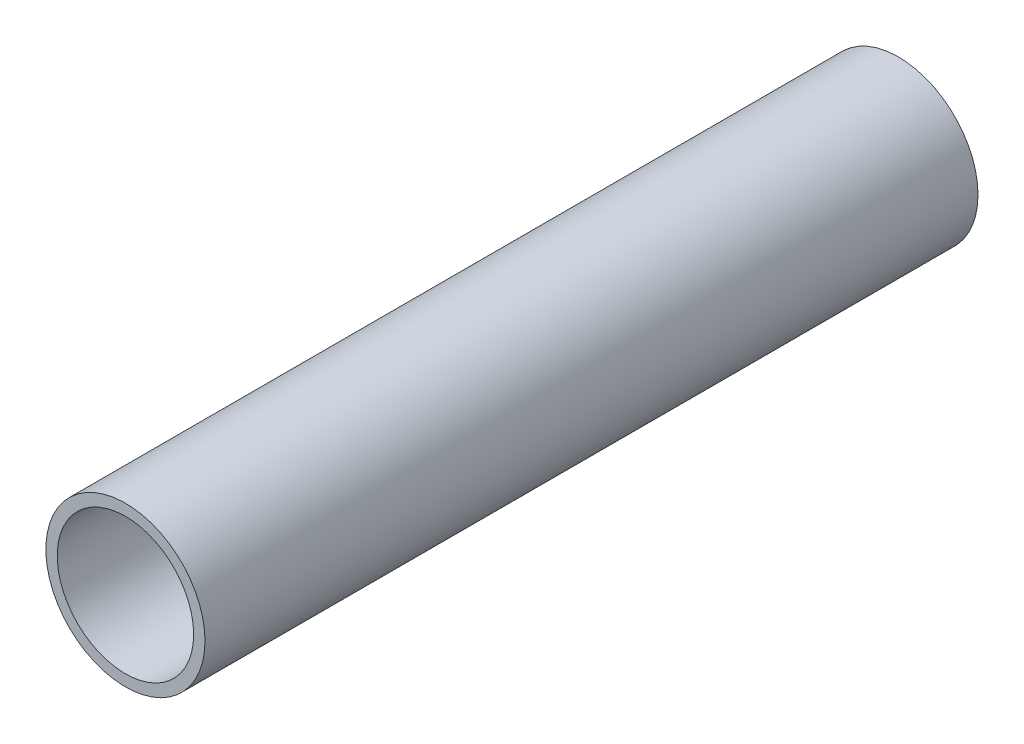
ISO-10303-21;
HEADER;
FILE_DESCRIPTION(('STEP AP214'),'2;1');
FILE_NAME('part.step','',(''),(''),'','','');
FILE_SCHEMA(('AUTOMOTIVE_DESIGN { 1 0 10303 214 1 1 1 1 }'));
ENDSEC;
DATA;
#1=APPLICATION_CONTEXT('core data for automotive mechanical design processes');
#2=APPLICATION_PROTOCOL_DEFINITION('international standard','automotive_design',2000,#1);
#3=PRODUCT_CONTEXT('',#1,'mechanical');
#4=PRODUCT('Part','Part','',(#3));
#5=PRODUCT_RELATED_PRODUCT_CATEGORY('part','',(#4));
#6=PRODUCT_DEFINITION_FORMATION('','',#4);
#7=PRODUCT_DEFINITION_CONTEXT('part definition',#1,'design');
#8=PRODUCT_DEFINITION('design','',#6,#7);
#9=PRODUCT_DEFINITION_SHAPE('','',#8);
#10=(LENGTH_UNIT() NAMED_UNIT(*) SI_UNIT(.MILLI.,.METRE.));
#11=(NAMED_UNIT(*) PLANE_ANGLE_UNIT() SI_UNIT($,.RADIAN.));
#12=(NAMED_UNIT(*) SI_UNIT($,.STERADIAN.) SOLID_ANGLE_UNIT());
#13=UNCERTAINTY_MEASURE_WITH_UNIT(LENGTH_MEASURE(1.E-05),#10,'distance_accuracy_value','');
#14=(GEOMETRIC_REPRESENTATION_CONTEXT(3) GLOBAL_UNCERTAINTY_ASSIGNED_CONTEXT((#13)) GLOBAL_UNIT_ASSIGNED_CONTEXT((#10,
#11,#12)) REPRESENTATION_CONTEXT('',''));
#15=CARTESIAN_POINT('',(0.,0.,0.));
#16=DIRECTION('',(0.,0.,1.));
#17=DIRECTION('',(1.,0.,0.));
#18=AXIS2_PLACEMENT_3D('',#15,#16,#17);
#19=CARTESIAN_POINT('',(0.,0.,-17.));
#20=DIRECTION('',(0.,0.,1.));
#21=DIRECTION('',(1.,0.,0.));
#22=AXIS2_PLACEMENT_3D('',#19,#20,#21);
#23=CYLINDRICAL_SURFACE('',#22,1.75);
#24=CARTESIAN_POINT('',(0.,0.,-17.));
#25=DIRECTION('',(0.,0.,1.));
#26=DIRECTION('',(1.,0.,0.));
#27=AXIS2_PLACEMENT_3D('',#24,#25,#26);
#28=CIRCLE('',#27,1.75);
#29=CARTESIAN_POINT('',(1.75,0.,-17.));
#30=VERTEX_POINT('',#29);
#31=EDGE_CURVE('E10',#30,#30,#28,.T.);
#32=ORIENTED_EDGE('',*,*,#31,.T.);
#33=EDGE_LOOP('',(#32));
#34=FACE_BOUND('',#33,.T.);
#35=CARTESIAN_POINT('',(0.,0.,0.));
#36=DIRECTION('',(0.,0.,1.));
#37=DIRECTION('',(1.,0.,0.));
#38=AXIS2_PLACEMENT_3D('',#35,#36,#37);
#39=CIRCLE('',#38,1.75);
#40=CARTESIAN_POINT('',(1.75,0.,0.));
#41=VERTEX_POINT('',#40);
#42=EDGE_CURVE('E35',#41,#41,#39,.T.);
#43=ORIENTED_EDGE('',*,*,#42,.F.);
#44=EDGE_LOOP('',(#43));
#45=FACE_BOUND('',#44,.T.);
#46=ADVANCED_FACE('F32',(#34,#45),#23,.T.);
#47=CARTESIAN_POINT('',(0.,0.,-17.));
#48=DIRECTION('',(0.,0.,1.));
#49=DIRECTION('',(1.,0.,0.));
#50=AXIS2_PLACEMENT_3D('',#47,#48,#49);
#51=PLANE('',#50);
#52=CARTESIAN_POINT('',(0.,0.,-17.));
#53=DIRECTION('',(0.,0.,1.));
#54=DIRECTION('',(1.,0.,0.));
#55=AXIS2_PLACEMENT_3D('',#52,#53,#54);
#56=CIRCLE('',#55,1.5);
#57=CARTESIAN_POINT('',(1.5,0.,-17.));
#58=VERTEX_POINT('',#57);
#59=EDGE_CURVE('E42',#58,#58,#56,.T.);
#60=ORIENTED_EDGE('',*,*,#59,.T.);
#61=EDGE_LOOP('',(#60));
#62=FACE_BOUND('',#61,.T.);
#63=ORIENTED_EDGE('',*,*,#31,.F.);
#64=EDGE_LOOP('',(#63));
#65=FACE_BOUND('',#64,.T.);
#66=ADVANCED_FACE('F50',(#62,#65),#51,.F.);
#67=CARTESIAN_POINT('',(0.,0.,0.));
#68=DIRECTION('',(0.,0.,1.));
#69=DIRECTION('',(1.,0.,0.));
#70=AXIS2_PLACEMENT_3D('',#67,#68,#69);
#71=PLANE('',#70);
#72=CARTESIAN_POINT('',(0.,0.,0.));
#73=DIRECTION('',(0.,0.,1.));
#74=DIRECTION('',(1.,0.,0.));
#75=AXIS2_PLACEMENT_3D('',#72,#73,#74);
#76=CIRCLE('',#75,1.5);
#77=CARTESIAN_POINT('',(1.5,0.,0.));
#78=VERTEX_POINT('',#77);
#79=EDGE_CURVE('E44',#78,#78,#76,.T.);
#80=ORIENTED_EDGE('',*,*,#79,.F.);
#81=EDGE_LOOP('',(#80));
#82=FACE_BOUND('',#81,.T.);
#83=ORIENTED_EDGE('',*,*,#42,.T.);
#84=EDGE_LOOP('',(#83));
#85=FACE_BOUND('',#84,.T.);
#86=ADVANCED_FACE('F56',(#82,#85),#71,.T.);
#87=CARTESIAN_POINT('',(0.,0.,-17.));
#88=DIRECTION('',(0.,0.,1.));
#89=DIRECTION('',(1.,0.,0.));
#90=AXIS2_PLACEMENT_3D('',#87,#88,#89);
#91=CYLINDRICAL_SURFACE('',#90,1.5);
#92=ORIENTED_EDGE('',*,*,#59,.F.);
#93=EDGE_LOOP('',(#92));
#94=FACE_BOUND('',#93,.T.);
#95=ORIENTED_EDGE('',*,*,#79,.T.);
#96=EDGE_LOOP('',(#95));
#97=FACE_BOUND('',#96,.T.);
#98=ADVANCED_FACE('F53',(#94,#97),#91,.F.);
#99=CLOSED_SHELL('',(#46,#66,#86,#98));
#100=MANIFOLD_SOLID_BREP('B2',#99);
#101=ADVANCED_BREP_SHAPE_REPRESENTATION('',(#18,#100),#14);
#102=SHAPE_DEFINITION_REPRESENTATION(#9,#101);
ENDSEC;
END-ISO-10303-21;
